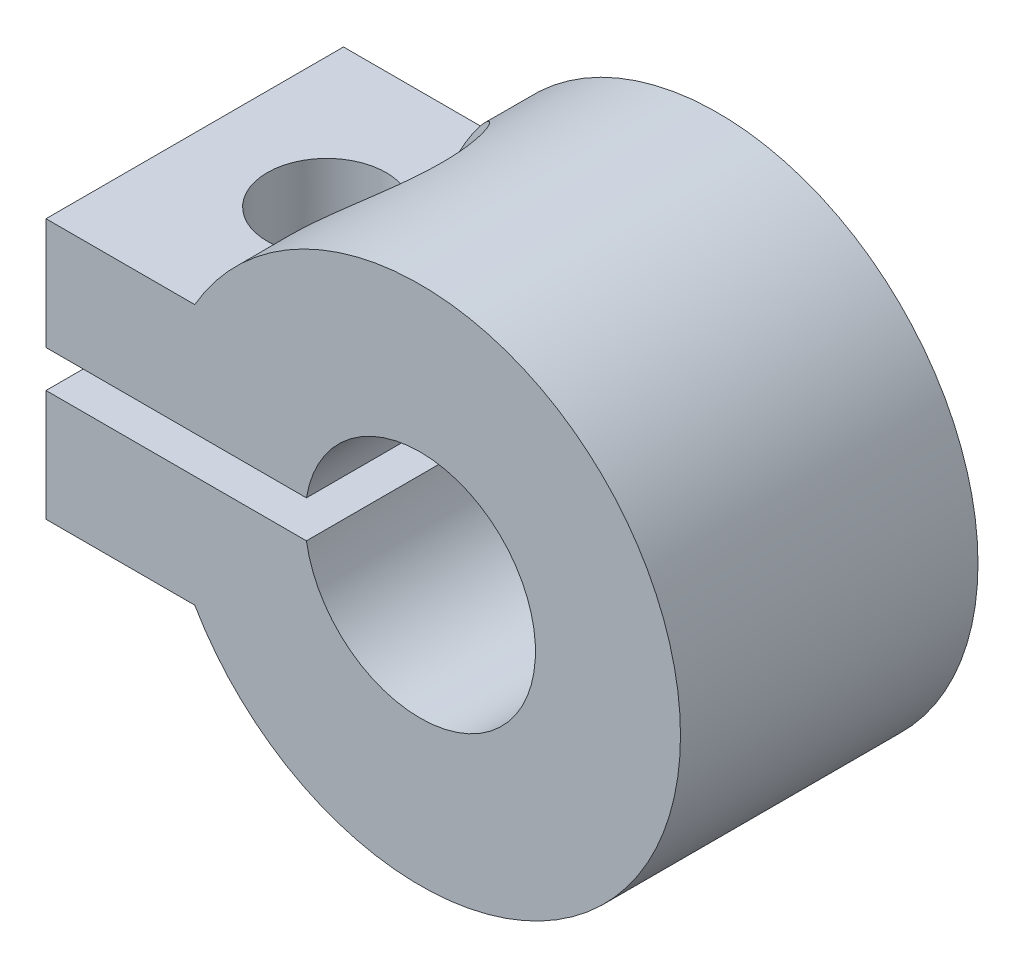
ISO-10303-21;
HEADER;
FILE_DESCRIPTION(('STEP AP214'),'2;1');
FILE_NAME('part.step','',(''),(''),'','','');
FILE_SCHEMA(('AUTOMOTIVE_DESIGN { 1 0 10303 214 1 1 1 1 }'));
ENDSEC;
DATA;
#1=APPLICATION_CONTEXT('core data for automotive mechanical design processes');
#2=APPLICATION_PROTOCOL_DEFINITION('international standard','automotive_design',2000,#1);
#3=PRODUCT_CONTEXT('',#1,'mechanical');
#4=PRODUCT('Part','Part','',(#3));
#5=PRODUCT_RELATED_PRODUCT_CATEGORY('part','',(#4));
#6=PRODUCT_DEFINITION_FORMATION('','',#4);
#7=PRODUCT_DEFINITION_CONTEXT('part definition',#1,'design');
#8=PRODUCT_DEFINITION('design','',#6,#7);
#9=PRODUCT_DEFINITION_SHAPE('','',#8);
#10=(LENGTH_UNIT() NAMED_UNIT(*) SI_UNIT(.MILLI.,.METRE.));
#11=(NAMED_UNIT(*) PLANE_ANGLE_UNIT() SI_UNIT($,.RADIAN.));
#12=(NAMED_UNIT(*) SI_UNIT($,.STERADIAN.) SOLID_ANGLE_UNIT());
#13=UNCERTAINTY_MEASURE_WITH_UNIT(LENGTH_MEASURE(1.E-05),#10,'distance_accuracy_value','');
#14=(GEOMETRIC_REPRESENTATION_CONTEXT(3) GLOBAL_UNCERTAINTY_ASSIGNED_CONTEXT((#13)) GLOBAL_UNIT_ASSIGNED_CONTEXT((#10,
#11,#12)) REPRESENTATION_CONTEXT('',''));
#15=CARTESIAN_POINT('',(0.,0.,0.));
#16=DIRECTION('',(0.,0.,1.));
#17=DIRECTION('',(1.,0.,0.));
#18=AXIS2_PLACEMENT_3D('',#15,#16,#17);
#19=CARTESIAN_POINT('',(0.,0.,8.));
#20=DIRECTION('',(0.,0.,-1.));
#21=DIRECTION('',(-1.,0.,0.));
#22=AXIS2_PLACEMENT_3D('',#19,#20,#21);
#23=CYLINDRICAL_SURFACE('',#22,7.);
#24=CARTESIAN_POINT('',(-6.06217782649107,-3.5,0.892015779297149));
#25=CARTESIAN_POINT('',(-5.99715331953693,-3.61267851254011,0.902664147034755));
#26=CARTESIAN_POINT('',(-5.92901369950133,-3.72339528294604,0.915909998391938));
#27=CARTESIAN_POINT('',(-5.78703130627478,-3.9404346385109,0.949009789494316));
#28=CARTESIAN_POINT('',(-5.7131759264646,-4.04674666784462,0.968878675401639));
#29=CARTESIAN_POINT('',(-5.55991630311654,-4.25490336275139,1.01681278735348));
#30=CARTESIAN_POINT('',(-5.48046877439328,-4.35670022197631,1.04494892507431));
#31=CARTESIAN_POINT('',(-5.31777564000623,-4.55385069433295,1.11080186428753));
#32=CARTESIAN_POINT('',(-5.23453396564627,-4.64921073367533,1.14850892603456));
#33=CARTESIAN_POINT('',(-5.09072332605521,-4.80543940412738,1.22209173862365));
#34=CARTESIAN_POINT('',(-5.03074108028005,-4.8681586796084,1.2552023207041));
#35=CARTESIAN_POINT('',(-4.9102867537466,-4.98962837466958,1.3272744722048));
#36=CARTESIAN_POINT('',(-4.84981480966349,-5.048379861623,1.36623445891614));
#37=CARTESIAN_POINT('',(-4.72933827508635,-5.16141084331707,1.45021325621945));
#38=CARTESIAN_POINT('',(-4.6693328090201,-5.21570401001645,1.49521233629121));
#39=CARTESIAN_POINT('',(-4.55049903335315,-5.31969825097555,1.59155565682957));
#40=CARTESIAN_POINT('',(-4.49167016531567,-5.36940154624487,1.642896799997));
#41=CARTESIAN_POINT('',(-4.37554372637019,-5.46445826305795,1.75254820735033));
#42=CARTESIAN_POINT('',(-4.31826715675119,-5.50976359985729,1.81092260072521));
#43=CARTESIAN_POINT('',(-4.206925172967,-5.59523958536327,1.93408476637751));
#44=CARTESIAN_POINT('',(-4.15285822242793,-5.63541270153498,1.99886942994196));
#45=CARTESIAN_POINT('',(-4.04890221371259,-5.71056128727849,2.13462799558343));
#46=CARTESIAN_POINT('',(-3.99901654109473,-5.7455325623592,2.20560681992073));
#47=CARTESIAN_POINT('',(-3.90446976448586,-5.81019780052158,2.35322015595862));
#48=CARTESIAN_POINT('',(-3.85980794785864,-5.83989248372131,2.42985389388662));
#49=CARTESIAN_POINT('',(-3.78181108483016,-5.89065296909429,2.57822591562688));
#50=CARTESIAN_POINT('',(-3.74775802761077,-5.91233344284957,2.64937824477895));
#51=CARTESIAN_POINT('',(-3.68484609387665,-5.95174663000883,2.79502914997183));
#52=CARTESIAN_POINT('',(-3.65598893429653,-5.96947803893905,2.86952882198589));
#53=CARTESIAN_POINT('',(-3.60394510224944,-6.00104232581181,3.02122299574071));
#54=CARTESIAN_POINT('',(-3.58075404881294,-6.01487821699423,3.09841536240654));
#55=CARTESIAN_POINT('',(-3.54035037427972,-6.03874662331608,3.25493172906739));
#56=CARTESIAN_POINT('',(-3.5231399108393,-6.04877776591082,3.33425648728258));
#57=CARTESIAN_POINT('',(-3.48266941739011,-6.07223306953731,3.56442100332974));
#58=CARTESIAN_POINT('',(-3.46724868493904,-6.08097197161534,3.71722655925148));
#59=CARTESIAN_POINT('',(-3.45922634105349,-6.08553713134954,4.02353053436269));
#60=CARTESIAN_POINT('',(-3.46662148578145,-6.08136522459416,4.17702885196069));
#61=CARTESIAN_POINT('',(-3.50362130228214,-6.06012215090116,4.47875229833122));
#62=CARTESIAN_POINT('',(-3.53298797909392,-6.04318919703688,4.62701623224514));
#63=CARTESIAN_POINT('',(-3.61218360683314,-5.99618466818375,4.9157649276012));
#64=CARTESIAN_POINT('',(-3.66201064990956,-5.9661143181902,5.05625041296827));
#65=CARTESIAN_POINT('',(-3.77983634514872,-5.89217026009642,5.32634161622281));
#66=CARTESIAN_POINT('',(-3.84792393766425,-5.84822880038202,5.45588988999695));
#67=CARTESIAN_POINT('',(-3.9985117826281,-5.74631502350835,5.70020365363563));
#68=CARTESIAN_POINT('',(-4.08101273181109,-5.68834202801924,5.81496842840689));
#69=CARTESIAN_POINT('',(-4.2590645956453,-5.55635103671837,6.03132460012726));
#70=CARTESIAN_POINT('',(-4.35496461539249,-5.48185326226425,6.13233323850154));
#71=CARTESIAN_POINT('',(-4.55253802224018,-5.31890581985589,6.31564556884787));
#72=CARTESIAN_POINT('',(-4.6542122452851,-5.2304541284493,6.39794654379718));
#73=CARTESIAN_POINT('',(-4.82622341438986,-5.07115982645371,6.52122393979201));
#74=CARTESIAN_POINT('',(-4.89626546044536,-5.00363711547566,6.56702606970449));
#75=CARTESIAN_POINT('',(-5.03573332080833,-4.86324690134658,6.6507943428094));
#76=CARTESIAN_POINT('',(-5.10515890730655,-4.79037750755471,6.6887576958559));
#77=CARTESIAN_POINT('',(-5.24251720297716,-4.6396595661385,6.75756647980985));
#78=CARTESIAN_POINT('',(-5.31044554430128,-4.56179852302362,6.78839308022821));
#79=CARTESIAN_POINT('',(-5.44382735301708,-4.40177300042942,6.84357244813085));
#80=CARTESIAN_POINT('',(-5.50928010557785,-4.31960729406129,6.86792335780536));
#81=CARTESIAN_POINT('',(-5.6616978850978,-4.11904720393583,6.91923222305037));
#82=CARTESIAN_POINT('',(-5.74723682749792,-3.99888994768047,6.9435808033607));
#83=CARTESIAN_POINT('',(-5.86983138958887,-3.81451113237472,6.9734148842479));
#84=CARTESIAN_POINT('',(-5.90961639460219,-3.75258175311048,6.98222576298367));
#85=CARTESIAN_POINT('',(-5.98731874452808,-3.62731894372328,6.99791798916992));
#86=CARTESIAN_POINT('',(-6.02523603477983,-3.56398547258651,7.00479928017639));
#87=CARTESIAN_POINT('',(-6.06217782649107,-3.5,7.01083919560849));
#88=B_SPLINE_CURVE_WITH_KNOTS('',3,(#24,#25,#26,#27,#28,#29,#30,#31,#32,#33,#34,#35,#36,#37,#38,
#39,#40,#41,#42,#43,#44,#45,#46,#47,#48,#49,#50,#51,#52,#53,#54,#55,#56,#57,#58,#59,#60,#61,#62,
#63,#64,#65,#66,#67,#68,#69,#70,#71,#72,#73,#74,#75,#76,#77,#78,#79,#80,#81,#82,#83,#84,#85,#86,
#87),.UNSPECIFIED.,.F.,.F.,(4,2,2,2,2,2,2,2,2,2,2,2,2,2,2,2,2,2,2,2,2,2,2,2,2,2,2,2,2,2,2,4),
(0.,0.391620383733716,0.78413058640645,1.18011101433281,1.57569008151373,1.85411029838851,
2.13245531672985,2.40991213153336,2.68723397540229,2.96730908008002,3.2472490196138,
3.52741347837415,3.80753967253112,4.05264058305641,4.29782233678574,4.54281391452,
4.78789378791508,5.24696898647167,5.70597891921637,6.16008757593067,6.61415389835888,
7.07047328868962,7.5268147433842,7.99871954431752,8.4706928389997,8.79288441490978,
9.11519047522692,9.43833749453411,9.761577121663,10.2093375525698,10.4316886909369,
10.6540463328064),.UNSPECIFIED.);
#89=CARTESIAN_POINT('',(-6.06217782649107,-3.5,0.892015779297149));
#90=VERTEX_POINT('',#89);
#91=CARTESIAN_POINT('',(-6.06217782649107,-3.5,7.01083919560849));
#92=VERTEX_POINT('',#91);
#93=EDGE_CURVE('E183',#90,#92,#88,.T.);
#94=ORIENTED_EDGE('',*,*,#93,.F.);
#95=DIRECTION('',(0.,0.,-1.));
#96=VECTOR('',#95,1.);
#97=CARTESIAN_POINT('',(-6.06217782649107,-3.5,8.));
#98=LINE('',#97,#96);
#99=CARTESIAN_POINT('',(-6.06217782649107,-3.5,0.));
#100=VERTEX_POINT('',#99);
#101=EDGE_CURVE('E88',#90,#100,#98,.T.);
#102=ORIENTED_EDGE('',*,*,#101,.T.);
#103=CARTESIAN_POINT('',(0.,0.,0.));
#104=DIRECTION('',(0.,0.,1.));
#105=DIRECTION('',(1.,0.,0.));
#106=AXIS2_PLACEMENT_3D('',#103,#104,#105);
#107=CIRCLE('',#106,7.);
#108=CARTESIAN_POINT('',(-6.06217782649107,3.5,0.));
#109=VERTEX_POINT('',#108);
#110=EDGE_CURVE('E135',#100,#109,#107,.T.);
#111=ORIENTED_EDGE('',*,*,#110,.T.);
#112=DIRECTION('',(0.,0.,-1.));
#113=VECTOR('',#112,1.);
#114=CARTESIAN_POINT('',(-6.06217782649107,3.5,8.));
#115=LINE('',#114,#113);
#116=CARTESIAN_POINT('',(-6.06217782649107,3.5,0.892015779297149));
#117=VERTEX_POINT('',#116);
#118=EDGE_CURVE('E164',#117,#109,#115,.T.);
#119=ORIENTED_EDGE('',*,*,#118,.F.);
#120=CARTESIAN_POINT('',(-6.06217782649107,3.5,7.01083919560849));
#121=CARTESIAN_POINT('',(-5.99715331953693,3.61267851254011,7.00019082787089));
#122=CARTESIAN_POINT('',(-5.92901369950133,3.72339528294603,6.9869449765137));
#123=CARTESIAN_POINT('',(-5.78703130627479,3.9404346385109,6.95384518541132));
#124=CARTESIAN_POINT('',(-5.7131759264646,4.04674666784462,6.933976299504));
#125=CARTESIAN_POINT('',(-5.55991630311654,4.25490336275138,6.88604218755216));
#126=CARTESIAN_POINT('',(-5.48046877439329,4.35670022197631,6.85790604983133));
#127=CARTESIAN_POINT('',(-5.31777564000624,4.55385069433295,6.79205311061811));
#128=CARTESIAN_POINT('',(-5.23453396564627,4.64921073367533,6.75434604887108));
#129=CARTESIAN_POINT('',(-5.09072332605521,4.80543940412738,6.68076323628199));
#130=CARTESIAN_POINT('',(-5.03074108028005,4.86815867960839,6.64765265420154));
#131=CARTESIAN_POINT('',(-4.9102867537466,4.98962837466958,6.57558050270085));
#132=CARTESIAN_POINT('',(-4.8498148096635,5.048379861623,6.5366205159895));
#133=CARTESIAN_POINT('',(-4.72933827508635,5.16141084331707,6.45264171868619));
#134=CARTESIAN_POINT('',(-4.6693328090201,5.21570401001645,6.40764263861443));
#135=CARTESIAN_POINT('',(-4.55049903335315,5.31969825097555,6.31129931807607));
#136=CARTESIAN_POINT('',(-4.49167016531567,5.36940154624487,6.25995817490864));
#137=CARTESIAN_POINT('',(-4.37554372637019,5.46445826305795,6.15030676755531));
#138=CARTESIAN_POINT('',(-4.31826715675119,5.50976359985728,6.09193237418043));
#139=CARTESIAN_POINT('',(-4.206925172967,5.59523958536326,5.96877020852813));
#140=CARTESIAN_POINT('',(-4.15285822242793,5.63541270153498,5.90398554496368));
#141=CARTESIAN_POINT('',(-4.04890221371259,5.71056128727849,5.76822697932221));
#142=CARTESIAN_POINT('',(-3.99901654109473,5.7455325623592,5.69724815498491));
#143=CARTESIAN_POINT('',(-3.90446976448586,5.81019780052158,5.54963481894702));
#144=CARTESIAN_POINT('',(-3.85980794785864,5.83989248372131,5.47300108101902));
#145=CARTESIAN_POINT('',(-3.78181108483016,5.8906529690943,5.32462905927876));
#146=CARTESIAN_POINT('',(-3.74775802761077,5.91233344284957,5.2534767301267));
#147=CARTESIAN_POINT('',(-3.68484609387665,5.95174663000883,5.10782582493382));
#148=CARTESIAN_POINT('',(-3.65598893429653,5.96947803893905,5.03332615291976));
#149=CARTESIAN_POINT('',(-3.60394510224944,6.00104232581181,4.88163197916493));
#150=CARTESIAN_POINT('',(-3.58075404881294,6.01487821699423,4.8044396124991));
#151=CARTESIAN_POINT('',(-3.54035037427972,6.03874662331608,4.64792324583826));
#152=CARTESIAN_POINT('',(-3.52313991083929,6.04877776591082,4.56859848762306));
#153=CARTESIAN_POINT('',(-3.48266941739011,6.07223306953731,4.33843397157591));
#154=CARTESIAN_POINT('',(-3.46724868493904,6.08097197161534,4.18562841565416));
#155=CARTESIAN_POINT('',(-3.45922634105349,6.08553713134954,3.87932444054295));
#156=CARTESIAN_POINT('',(-3.46662148578144,6.08136522459416,3.72582612294496));
#157=CARTESIAN_POINT('',(-3.50362130228214,6.06012215090116,3.42410267657442));
#158=CARTESIAN_POINT('',(-3.53298797909391,6.04318919703688,3.2758387426605));
#159=CARTESIAN_POINT('',(-3.61218360683313,5.99618466818375,2.98709004730444));
#160=CARTESIAN_POINT('',(-3.66201064990956,5.9661143181902,2.84660456193738));
#161=CARTESIAN_POINT('',(-3.77983634514872,5.89217026009642,2.57651335868283));
#162=CARTESIAN_POINT('',(-3.84792393766424,5.84822880038202,2.44696508490869));
#163=CARTESIAN_POINT('',(-3.9985117826281,5.74631502350835,2.20265132127001));
#164=CARTESIAN_POINT('',(-4.08101273181108,5.68834202801925,2.08788654649875));
#165=CARTESIAN_POINT('',(-4.25906459564529,5.55635103671837,1.87153037477838));
#166=CARTESIAN_POINT('',(-4.35496461539249,5.48185326226425,1.7705217364041));
#167=CARTESIAN_POINT('',(-4.55253802224017,5.31890581985589,1.58720940605777));
#168=CARTESIAN_POINT('',(-4.6542122452851,5.2304541284493,1.50490843110846));
#169=CARTESIAN_POINT('',(-4.82622341438985,5.07115982645372,1.38163103511363));
#170=CARTESIAN_POINT('',(-4.89626546044535,5.00363711547567,1.33582890520115));
#171=CARTESIAN_POINT('',(-5.03573332080832,4.86324690134659,1.25206063209624));
#172=CARTESIAN_POINT('',(-5.10515890730654,4.79037750755472,1.21409727904974));
#173=CARTESIAN_POINT('',(-5.24251720297715,4.63965956613851,1.14528849509579));
#174=CARTESIAN_POINT('',(-5.31044554430127,4.56179852302363,1.11446189467744));
#175=CARTESIAN_POINT('',(-5.44382735301707,4.40177300042943,1.05928252677479));
#176=CARTESIAN_POINT('',(-5.50928010557785,4.3196072940613,1.03493161710028));
#177=CARTESIAN_POINT('',(-5.6616978850978,4.11904720393584,0.983622751855271));
#178=CARTESIAN_POINT('',(-5.74723682749792,3.99888994768048,0.959274171544942));
#179=CARTESIAN_POINT('',(-5.86983138958887,3.81451113237472,0.929440090657741));
#180=CARTESIAN_POINT('',(-5.90961639460219,3.75258175311048,0.920629211921966));
#181=CARTESIAN_POINT('',(-5.98731874452808,3.62731894372328,0.904936985735721));
#182=CARTESIAN_POINT('',(-6.02523603477983,3.56398547258651,0.898055694729248));
#183=CARTESIAN_POINT('',(-6.06217782649107,3.5,0.892015779297149));
#184=B_SPLINE_CURVE_WITH_KNOTS('',3,(#120,#121,#122,#123,#124,#125,#126,#127,#128,#129,#130,
#131,#132,#133,#134,#135,#136,#137,#138,#139,#140,#141,#142,#143,#144,#145,#146,#147,#148,#149,
#150,#151,#152,#153,#154,#155,#156,#157,#158,#159,#160,#161,#162,#163,#164,#165,#166,#167,#168,
#169,#170,#171,#172,#173,#174,#175,#176,#177,#178,#179,#180,#181,#182,#183),.UNSPECIFIED.,.F.,
.F.,(4,2,2,2,2,2,2,2,2,2,2,2,2,2,2,2,2,2,2,2,2,2,2,2,2,2,2,2,2,2,2,4),(0.,0.391620383733716,
0.78413058640645,1.18011101433281,1.57569008151373,1.85411029838852,2.13245531672985,
2.40991213153337,2.6872339754023,2.96730908008003,3.2472490196138,3.52741347837415,
3.80753967253112,4.05264058305641,4.29782233678574,4.54281391452001,4.78789378791509,
5.24696898647167,5.70597891921637,6.16008757593067,6.61415389835889,7.07047328868962,
7.5268147433842,7.99871954431752,8.4706928389997,8.79288441490978,9.11519047522692,
9.43833749453411,9.761577121663,10.2093375525698,10.4316886909369,10.6540463328064),.UNSPECIFIED.);
#185=CARTESIAN_POINT('',(-6.06217782649107,3.5,7.01083919560849));
#186=VERTEX_POINT('',#185);
#187=EDGE_CURVE('E339',#186,#117,#184,.T.);
#188=ORIENTED_EDGE('',*,*,#187,.F.);
#189=CARTESIAN_POINT('',(-6.06217782649107,3.5,8.));
#190=VERTEX_POINT('',#189);
#191=EDGE_CURVE('E42',#190,#186,#115,.T.);
#192=ORIENTED_EDGE('',*,*,#191,.F.);
#193=CARTESIAN_POINT('',(0.,0.,8.));
#194=DIRECTION('',(0.,0.,1.));
#195=DIRECTION('',(1.,0.,0.));
#196=AXIS2_PLACEMENT_3D('',#193,#194,#195);
#197=CIRCLE('',#196,7.);
#198=CARTESIAN_POINT('',(-6.06217782649107,-3.5,8.));
#199=VERTEX_POINT('',#198);
#200=EDGE_CURVE('E150',#199,#190,#197,.T.);
#201=ORIENTED_EDGE('',*,*,#200,.F.);
#202=EDGE_CURVE('E151',#199,#92,#98,.T.);
#203=ORIENTED_EDGE('',*,*,#202,.T.);
#204=EDGE_LOOP('',(#94,#102,#111,#119,#188,#192,#201,#203));
#205=FACE_BOUND('',#204,.T.);
#206=ADVANCED_FACE('F33',(#205),#23,.T.);
#207=CARTESIAN_POINT('',(-6.56217782649108,-7.,3.95142748745282));
#208=DIRECTION('',(0.,1.,0.));
#209=DIRECTION('',(-1.,0.,0.));
#210=AXIS2_PLACEMENT_3D('',#207,#208,#209);
#211=CYLINDRICAL_SURFACE('',#210,1.6);
#212=CARTESIAN_POINT('',(-6.56217782649107,-0.5,3.95142748745282));
#213=DIRECTION('',(0.,-1.,0.));
#214=DIRECTION('',(0.,0.,-1.));
#215=AXIS2_PLACEMENT_3D('',#212,#213,#214);
#216=CIRCLE('',#215,1.6);
#217=CARTESIAN_POINT('',(-6.56217782649107,-0.5,2.35142748745282));
#218=VERTEX_POINT('',#217);
#219=EDGE_CURVE('E217',#218,#218,#216,.T.);
#220=ORIENTED_EDGE('',*,*,#219,.F.);
#221=EDGE_LOOP('',(#220));
#222=FACE_BOUND('',#221,.T.);
#223=CARTESIAN_POINT('',(-6.56217782649107,-3.5,3.95142748745282));
#224=DIRECTION('',(0.,1.,0.));
#225=DIRECTION('',(0.,0.,1.));
#226=AXIS2_PLACEMENT_3D('',#223,#224,#225);
#227=CIRCLE('',#226,1.6);
#228=CARTESIAN_POINT('',(-6.56217782649107,-3.5,5.55142748745282));
#229=VERTEX_POINT('',#228);
#230=EDGE_CURVE('E11',#229,#229,#227,.T.);
#231=ORIENTED_EDGE('',*,*,#230,.F.);
#232=EDGE_LOOP('',(#231));
#233=FACE_BOUND('',#232,.T.);
#234=ADVANCED_FACE('F185',(#222,#233),#211,.F.);
#235=CARTESIAN_POINT('',(-6.06217782649107,3.5,8.));
#236=DIRECTION('',(0.,-1.,0.));
#237=DIRECTION('',(0.,0.,-1.));
#238=AXIS2_PLACEMENT_3D('',#235,#236,#237);
#239=PLANE('',#238);
#240=CARTESIAN_POINT('',(-6.56217782649107,3.5,3.95142748745282));
#241=DIRECTION('',(0.,1.,0.));
#242=DIRECTION('',(-1.,0.,0.));
#243=AXIS2_PLACEMENT_3D('',#240,#241,#242);
#244=CIRCLE('',#243,3.1);
#245=EDGE_CURVE('E173',#186,#117,#244,.T.);
#246=ORIENTED_EDGE('',*,*,#245,.T.);
#247=ORIENTED_EDGE('',*,*,#118,.T.);
#248=DIRECTION('',(-1.,0.,0.));
#249=VECTOR('',#248,1.);
#250=CARTESIAN_POINT('',(-6.06217782649107,3.5,0.));
#251=LINE('',#250,#249);
#252=CARTESIAN_POINT('',(-10.0621778264911,3.5,0.));
#253=VERTEX_POINT('',#252);
#254=EDGE_CURVE('E137',#109,#253,#251,.T.);
#255=ORIENTED_EDGE('',*,*,#254,.T.);
#256=DIRECTION('',(0.,0.,-1.));
#257=VECTOR('',#256,1.);
#258=CARTESIAN_POINT('',(-10.0621778264911,3.5,8.));
#259=LINE('',#258,#257);
#260=CARTESIAN_POINT('',(-10.0621778264911,3.5,8.));
#261=VERTEX_POINT('',#260);
#262=EDGE_CURVE('E162',#261,#253,#259,.T.);
#263=ORIENTED_EDGE('',*,*,#262,.F.);
#264=DIRECTION('',(-1.,0.,0.));
#265=VECTOR('',#264,1.);
#266=CARTESIAN_POINT('',(-6.06217782649107,3.5,8.));
#267=LINE('',#266,#265);
#268=EDGE_CURVE('E97',#190,#261,#267,.T.);
#269=ORIENTED_EDGE('',*,*,#268,.F.);
#270=ORIENTED_EDGE('',*,*,#191,.T.);
#271=EDGE_LOOP('',(#246,#247,#255,#263,#269,#270));
#272=FACE_BOUND('',#271,.T.);
#273=CARTESIAN_POINT('',(-6.56217782649107,3.5,3.95142748745282));
#274=DIRECTION('',(0.,1.,0.));
#275=DIRECTION('',(-1.,0.,0.));
#276=AXIS2_PLACEMENT_3D('',#273,#274,#275);
#277=CIRCLE('',#276,1.6);
#278=CARTESIAN_POINT('',(-8.16217782649107,3.5,3.95142748745282));
#279=VERTEX_POINT('',#278);
#280=EDGE_CURVE('E213',#279,#279,#277,.T.);
#281=ORIENTED_EDGE('',*,*,#280,.F.);
#282=EDGE_LOOP('',(#281));
#283=FACE_BOUND('',#282,.T.);
#284=ADVANCED_FACE('F170',(#272,#283),#239,.F.);
#285=CARTESIAN_POINT('',(-10.0621778264911,3.5,8.));
#286=DIRECTION('',(1.,0.,0.));
#287=DIRECTION('',(0.,0.,-1.));
#288=AXIS2_PLACEMENT_3D('',#285,#286,#287);
#289=PLANE('',#288);
#290=DIRECTION('',(0.,-1.,0.));
#291=VECTOR('',#290,1.);
#292=CARTESIAN_POINT('',(-10.0621778264911,3.5,0.));
#293=LINE('',#292,#291);
#294=CARTESIAN_POINT('',(-10.0621778264911,0.5,0.));
#295=VERTEX_POINT('',#294);
#296=EDGE_CURVE('E140',#253,#295,#293,.T.);
#297=ORIENTED_EDGE('',*,*,#296,.T.);
#298=DIRECTION('',(0.,0.,-1.));
#299=VECTOR('',#298,1.);
#300=CARTESIAN_POINT('',(-10.0621778264911,0.5,8.));
#301=LINE('',#300,#299);
#302=CARTESIAN_POINT('',(-10.0621778264911,0.5,8.));
#303=VERTEX_POINT('',#302);
#304=EDGE_CURVE('E159',#303,#295,#301,.T.);
#305=ORIENTED_EDGE('',*,*,#304,.F.);
#306=DIRECTION('',(0.,-1.,0.));
#307=VECTOR('',#306,1.);
#308=CARTESIAN_POINT('',(-10.0621778264911,3.5,8.));
#309=LINE('',#308,#307);
#310=EDGE_CURVE('E225',#261,#303,#309,.T.);
#311=ORIENTED_EDGE('',*,*,#310,.F.);
#312=ORIENTED_EDGE('',*,*,#262,.T.);
#313=EDGE_LOOP('',(#297,#305,#311,#312));
#314=FACE_BOUND('',#313,.T.);
#315=ADVANCED_FACE('F195',(#314),#289,.F.);
#316=CARTESIAN_POINT('',(-10.0621778264911,0.5,8.));
#317=DIRECTION('',(0.,1.,0.));
#318=DIRECTION('',(0.,0.,1.));
#319=AXIS2_PLACEMENT_3D('',#316,#317,#318);
#320=PLANE('',#319);
#321=CARTESIAN_POINT('',(-6.56217782649107,0.5,3.95142748745282));
#322=DIRECTION('',(0.,1.,0.));
#323=DIRECTION('',(0.,0.,1.));
#324=AXIS2_PLACEMENT_3D('',#321,#322,#323);
#325=CIRCLE('',#324,1.6);
#326=CARTESIAN_POINT('',(-6.56217782649107,0.5,5.55142748745282));
#327=VERTEX_POINT('',#326);
#328=EDGE_CURVE('E138',#327,#327,#325,.T.);
#329=ORIENTED_EDGE('',*,*,#328,.T.);
#330=EDGE_LOOP('',(#329));
#331=FACE_BOUND('',#330,.T.);
#332=DIRECTION('',(1.,0.,0.));
#333=VECTOR('',#332,1.);
#334=CARTESIAN_POINT('',(-10.0621778264911,0.5,0.));
#335=LINE('',#334,#333);
#336=CARTESIAN_POINT('',(-3.05941170815567,0.5,0.));
#337=VERTEX_POINT('',#336);
#338=EDGE_CURVE('E142',#295,#337,#335,.T.);
#339=ORIENTED_EDGE('',*,*,#338,.T.);
#340=DIRECTION('',(0.,0.,-1.));
#341=VECTOR('',#340,1.);
#342=CARTESIAN_POINT('',(-3.05941170815567,0.5,8.));
#343=LINE('',#342,#341);
#344=CARTESIAN_POINT('',(-3.05941170815567,0.5,8.));
#345=VERTEX_POINT('',#344);
#346=EDGE_CURVE('E156',#345,#337,#343,.T.);
#347=ORIENTED_EDGE('',*,*,#346,.F.);
#348=DIRECTION('',(1.,0.,0.));
#349=VECTOR('',#348,1.);
#350=CARTESIAN_POINT('',(-10.0621778264911,0.5,8.));
#351=LINE('',#350,#349);
#352=EDGE_CURVE('E227',#303,#345,#351,.T.);
#353=ORIENTED_EDGE('',*,*,#352,.F.);
#354=ORIENTED_EDGE('',*,*,#304,.T.);
#355=EDGE_LOOP('',(#339,#347,#353,#354));
#356=FACE_BOUND('',#355,.T.);
#357=ADVANCED_FACE('F233',(#331,#356),#320,.F.);
#358=CARTESIAN_POINT('',(0.,0.,8.));
#359=DIRECTION('',(0.,0.,-1.));
#360=DIRECTION('',(-1.,0.,0.));
#361=AXIS2_PLACEMENT_3D('',#358,#359,#360);
#362=CYLINDRICAL_SURFACE('',#361,3.1);
#363=CARTESIAN_POINT('',(0.,0.,0.));
#364=DIRECTION('',(0.,0.,-1.));
#365=DIRECTION('',(1.,0.,0.));
#366=AXIS2_PLACEMENT_3D('',#363,#364,#365);
#367=CIRCLE('',#366,3.1);
#368=CARTESIAN_POINT('',(-3.05941170815567,-0.499999999999999,0.));
#369=VERTEX_POINT('',#368);
#370=EDGE_CURVE('E144',#337,#369,#367,.T.);
#371=ORIENTED_EDGE('',*,*,#370,.T.);
#372=DIRECTION('',(0.,0.,-1.));
#373=VECTOR('',#372,1.);
#374=CARTESIAN_POINT('',(-3.05941170815567,-0.499999999999999,8.));
#375=LINE('',#374,#373);
#376=CARTESIAN_POINT('',(-3.05941170815567,-0.499999999999999,8.));
#377=VERTEX_POINT('',#376);
#378=EDGE_CURVE('E127',#377,#369,#375,.T.);
#379=ORIENTED_EDGE('',*,*,#378,.F.);
#380=CARTESIAN_POINT('',(0.,0.,8.));
#381=DIRECTION('',(0.,0.,-1.));
#382=DIRECTION('',(1.,0.,0.));
#383=AXIS2_PLACEMENT_3D('',#380,#381,#382);
#384=CIRCLE('',#383,3.1);
#385=EDGE_CURVE('E118',#345,#377,#384,.T.);
#386=ORIENTED_EDGE('',*,*,#385,.F.);
#387=ORIENTED_EDGE('',*,*,#346,.T.);
#388=EDGE_LOOP('',(#371,#379,#386,#387));
#389=FACE_BOUND('',#388,.T.);
#390=ADVANCED_FACE('F236',(#389),#362,.F.);
#391=CARTESIAN_POINT('',(-3.05941170815567,-0.5,8.));
#392=DIRECTION('',(0.,-1.,0.));
#393=DIRECTION('',(0.,0.,-1.));
#394=AXIS2_PLACEMENT_3D('',#391,#392,#393);
#395=PLANE('',#394);
#396=ORIENTED_EDGE('',*,*,#219,.T.);
#397=EDGE_LOOP('',(#396));
#398=FACE_BOUND('',#397,.T.);
#399=DIRECTION('',(-1.,0.,0.));
#400=VECTOR('',#399,1.);
#401=CARTESIAN_POINT('',(-3.05941170815567,-0.5,0.));
#402=LINE('',#401,#400);
#403=CARTESIAN_POINT('',(-10.0621778264911,-0.5,0.));
#404=VERTEX_POINT('',#403);
#405=EDGE_CURVE('E126',#369,#404,#402,.T.);
#406=ORIENTED_EDGE('',*,*,#405,.T.);
#407=DIRECTION('',(0.,0.,-1.));
#408=VECTOR('',#407,1.);
#409=CARTESIAN_POINT('',(-10.0621778264911,-0.5,8.));
#410=LINE('',#409,#408);
#411=CARTESIAN_POINT('',(-10.0621778264911,-0.5,8.));
#412=VERTEX_POINT('',#411);
#413=EDGE_CURVE('E123',#412,#404,#410,.T.);
#414=ORIENTED_EDGE('',*,*,#413,.F.);
#415=DIRECTION('',(-1.,0.,0.));
#416=VECTOR('',#415,1.);
#417=CARTESIAN_POINT('',(-3.05941170815567,-0.5,8.));
#418=LINE('',#417,#416);
#419=EDGE_CURVE('E112',#377,#412,#418,.T.);
#420=ORIENTED_EDGE('',*,*,#419,.F.);
#421=ORIENTED_EDGE('',*,*,#378,.T.);
#422=EDGE_LOOP('',(#406,#414,#420,#421));
#423=FACE_BOUND('',#422,.T.);
#424=ADVANCED_FACE('F124',(#398,#423),#395,.F.);
#425=CARTESIAN_POINT('',(-10.0621778264911,-0.5,8.));
#426=DIRECTION('',(1.,0.,0.));
#427=DIRECTION('',(0.,0.,-1.));
#428=AXIS2_PLACEMENT_3D('',#425,#426,#427);
#429=PLANE('',#428);
#430=DIRECTION('',(0.,-1.,0.));
#431=VECTOR('',#430,1.);
#432=CARTESIAN_POINT('',(-10.0621778264911,-0.5,0.));
#433=LINE('',#432,#431);
#434=CARTESIAN_POINT('',(-10.0621778264911,-3.5,0.));
#435=VERTEX_POINT('',#434);
#436=EDGE_CURVE('E80',#404,#435,#433,.T.);
#437=ORIENTED_EDGE('',*,*,#436,.T.);
#438=DIRECTION('',(0.,0.,-1.));
#439=VECTOR('',#438,1.);
#440=CARTESIAN_POINT('',(-10.0621778264911,-3.5,8.));
#441=LINE('',#440,#439);
#442=CARTESIAN_POINT('',(-10.0621778264911,-3.5,8.));
#443=VERTEX_POINT('',#442);
#444=EDGE_CURVE('E128',#443,#435,#441,.T.);
#445=ORIENTED_EDGE('',*,*,#444,.F.);
#446=DIRECTION('',(0.,-1.,0.));
#447=VECTOR('',#446,1.);
#448=CARTESIAN_POINT('',(-10.0621778264911,-0.5,8.));
#449=LINE('',#448,#447);
#450=EDGE_CURVE('E116',#412,#443,#449,.T.);
#451=ORIENTED_EDGE('',*,*,#450,.F.);
#452=ORIENTED_EDGE('',*,*,#413,.T.);
#453=EDGE_LOOP('',(#437,#445,#451,#452));
#454=FACE_BOUND('',#453,.T.);
#455=ADVANCED_FACE('F130',(#454),#429,.F.);
#456=CARTESIAN_POINT('',(-10.0621778264911,-3.5,8.));
#457=DIRECTION('',(0.,1.,0.));
#458=DIRECTION('',(0.,0.,1.));
#459=AXIS2_PLACEMENT_3D('',#456,#457,#458);
#460=PLANE('',#459);
#461=ORIENTED_EDGE('',*,*,#230,.T.);
#462=EDGE_LOOP('',(#461));
#463=FACE_BOUND('',#462,.T.);
#464=ORIENTED_EDGE('',*,*,#101,.F.);
#465=CARTESIAN_POINT('',(-6.56217782649107,-3.5,3.95142748745282));
#466=DIRECTION('',(0.,-1.,0.));
#467=DIRECTION('',(1.,0.,0.));
#468=AXIS2_PLACEMENT_3D('',#465,#466,#467);
#469=CIRCLE('',#468,3.1);
#470=EDGE_CURVE('E243',#90,#92,#469,.T.);
#471=ORIENTED_EDGE('',*,*,#470,.T.);
#472=ORIENTED_EDGE('',*,*,#202,.F.);
#473=DIRECTION('',(1.,0.,0.));
#474=VECTOR('',#473,1.);
#475=CARTESIAN_POINT('',(-10.0621778264911,-3.5,8.));
#476=LINE('',#475,#474);
#477=EDGE_CURVE('E50',#443,#199,#476,.T.);
#478=ORIENTED_EDGE('',*,*,#477,.F.);
#479=ORIENTED_EDGE('',*,*,#444,.T.);
#480=DIRECTION('',(1.,0.,0.));
#481=VECTOR('',#480,1.);
#482=CARTESIAN_POINT('',(-10.0621778264911,-3.5,0.));
#483=LINE('',#482,#481);
#484=EDGE_CURVE('E148',#435,#100,#483,.T.);
#485=ORIENTED_EDGE('',*,*,#484,.T.);
#486=EDGE_LOOP('',(#464,#471,#472,#478,#479,#485));
#487=FACE_BOUND('',#486,.T.);
#488=ADVANCED_FACE('F238',(#463,#487),#460,.F.);
#489=CARTESIAN_POINT('',(0.,0.,8.));
#490=DIRECTION('',(0.,0.,1.));
#491=DIRECTION('',(1.,0.,0.));
#492=AXIS2_PLACEMENT_3D('',#489,#490,#491);
#493=PLANE('',#492);
#494=ORIENTED_EDGE('',*,*,#200,.T.);
#495=ORIENTED_EDGE('',*,*,#268,.T.);
#496=ORIENTED_EDGE('',*,*,#310,.T.);
#497=ORIENTED_EDGE('',*,*,#352,.T.);
#498=ORIENTED_EDGE('',*,*,#385,.T.);
#499=ORIENTED_EDGE('',*,*,#419,.T.);
#500=ORIENTED_EDGE('',*,*,#450,.T.);
#501=ORIENTED_EDGE('',*,*,#477,.T.);
#502=EDGE_LOOP('',(#494,#495,#496,#497,#498,#499,#500,#501));
#503=FACE_BOUND('',#502,.T.);
#504=ADVANCED_FACE('F114',(#503),#493,.T.);
#505=CARTESIAN_POINT('',(0.,0.,0.));
#506=DIRECTION('',(0.,0.,1.));
#507=DIRECTION('',(1.,0.,0.));
#508=AXIS2_PLACEMENT_3D('',#505,#506,#507);
#509=PLANE('',#508);
#510=ORIENTED_EDGE('',*,*,#110,.F.);
#511=ORIENTED_EDGE('',*,*,#484,.F.);
#512=ORIENTED_EDGE('',*,*,#436,.F.);
#513=ORIENTED_EDGE('',*,*,#405,.F.);
#514=ORIENTED_EDGE('',*,*,#370,.F.);
#515=ORIENTED_EDGE('',*,*,#338,.F.);
#516=ORIENTED_EDGE('',*,*,#296,.F.);
#517=ORIENTED_EDGE('',*,*,#254,.F.);
#518=EDGE_LOOP('',(#510,#511,#512,#513,#514,#515,#516,#517));
#519=FACE_BOUND('',#518,.T.);
#520=ADVANCED_FACE('F178',(#519),#509,.F.);
#521=ORIENTED_EDGE('',*,*,#280,.T.);
#522=EDGE_LOOP('',(#521));
#523=FACE_BOUND('',#522,.T.);
#524=ORIENTED_EDGE('',*,*,#328,.F.);
#525=EDGE_LOOP('',(#524));
#526=FACE_BOUND('',#525,.T.);
#527=ADVANCED_FACE('F191',(#523,#526),#211,.F.);
#528=CARTESIAN_POINT('',(-6.56217782649107,7.,3.95142748745282));
#529=DIRECTION('',(0.,-1.,0.));
#530=DIRECTION('',(1.,0.,0.));
#531=AXIS2_PLACEMENT_3D('',#528,#529,#530);
#532=CYLINDRICAL_SURFACE('',#531,3.1);
#533=ORIENTED_EDGE('',*,*,#187,.T.);
#534=ORIENTED_EDGE('',*,*,#245,.F.);
#535=EDGE_LOOP('',(#533,#534));
#536=FACE_BOUND('',#535,.T.);
#537=ADVANCED_FACE('F201',(#536),#532,.F.);
#538=CARTESIAN_POINT('',(-6.56217782649107,-7.,3.95142748745282));
#539=DIRECTION('',(0.,1.,0.));
#540=DIRECTION('',(-1.,0.,0.));
#541=AXIS2_PLACEMENT_3D('',#538,#539,#540);
#542=CYLINDRICAL_SURFACE('',#541,3.1);
#543=ORIENTED_EDGE('',*,*,#93,.T.);
#544=ORIENTED_EDGE('',*,*,#470,.F.);
#545=EDGE_LOOP('',(#543,#544));
#546=FACE_BOUND('',#545,.T.);
#547=ADVANCED_FACE('F207',(#546),#542,.F.);
#548=CLOSED_SHELL('',(#206,#234,#284,#315,#357,#390,#424,#455,#488,#504,#520,#527,#537,#547));
#549=MANIFOLD_SOLID_BREP('B2',#548);
#550=ADVANCED_BREP_SHAPE_REPRESENTATION('',(#18,#549),#14);
#551=SHAPE_DEFINITION_REPRESENTATION(#9,#550);
ENDSEC;
END-ISO-10303-21;
